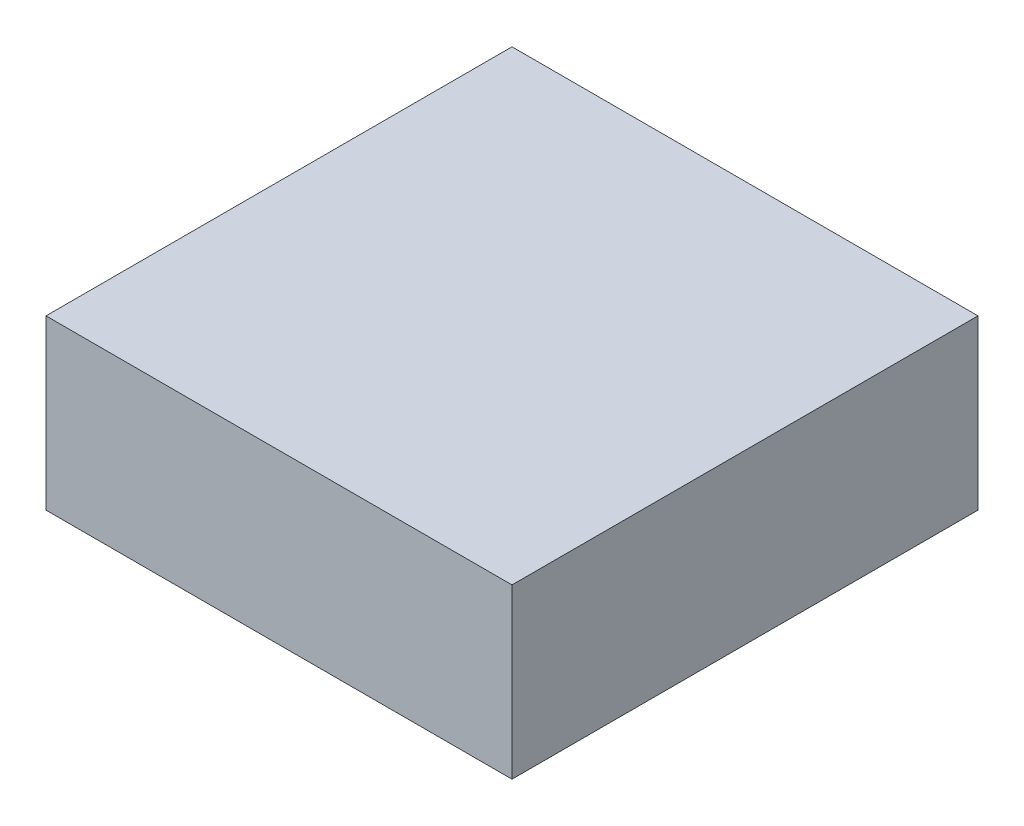
ISO-10303-21;
HEADER;
FILE_DESCRIPTION(('STEP AP214'),'2;1');
FILE_NAME('part.step','',(''),(''),'','','');
FILE_SCHEMA(('AUTOMOTIVE_DESIGN { 1 0 10303 214 1 1 1 1 }'));
ENDSEC;
DATA;
#1=APPLICATION_CONTEXT('core data for automotive mechanical design processes');
#2=APPLICATION_PROTOCOL_DEFINITION('international standard','automotive_design',2000,#1);
#3=PRODUCT_CONTEXT('',#1,'mechanical');
#4=PRODUCT('Part','Part','',(#3));
#5=PRODUCT_RELATED_PRODUCT_CATEGORY('part','',(#4));
#6=PRODUCT_DEFINITION_FORMATION('','',#4);
#7=PRODUCT_DEFINITION_CONTEXT('part definition',#1,'design');
#8=PRODUCT_DEFINITION('design','',#6,#7);
#9=PRODUCT_DEFINITION_SHAPE('','',#8);
#10=(LENGTH_UNIT() NAMED_UNIT(*) SI_UNIT(.MILLI.,.METRE.));
#11=(NAMED_UNIT(*) PLANE_ANGLE_UNIT() SI_UNIT($,.RADIAN.));
#12=(NAMED_UNIT(*) SI_UNIT($,.STERADIAN.) SOLID_ANGLE_UNIT());
#13=UNCERTAINTY_MEASURE_WITH_UNIT(LENGTH_MEASURE(1.E-05),#10,'distance_accuracy_value','');
#14=(GEOMETRIC_REPRESENTATION_CONTEXT(3) GLOBAL_UNCERTAINTY_ASSIGNED_CONTEXT((#13)) GLOBAL_UNIT_ASSIGNED_CONTEXT((#10,
#11,#12)) REPRESENTATION_CONTEXT('',''));
#15=CARTESIAN_POINT('',(0.,0.,0.));
#16=DIRECTION('',(0.,0.,1.));
#17=DIRECTION('',(1.,0.,0.));
#18=AXIS2_PLACEMENT_3D('',#15,#16,#17);
#19=CARTESIAN_POINT('',(0.,0.,0.));
#20=DIRECTION('',(0.,1.,0.));
#21=DIRECTION('',(0.,0.,1.));
#22=AXIS2_PLACEMENT_3D('',#19,#20,#21);
#23=PLANE('',#22);
#24=DIRECTION('',(0.,0.,-1.));
#25=VECTOR('',#24,1.);
#26=CARTESIAN_POINT('',(9.,0.,-9.));
#27=LINE('',#26,#25);
#28=CARTESIAN_POINT('',(9.00000000000001,0.,9.));
#29=VERTEX_POINT('',#28);
#30=CARTESIAN_POINT('',(9.,0.,-9.));
#31=VERTEX_POINT('',#30);
#32=EDGE_CURVE('E105',#29,#31,#27,.T.);
#33=ORIENTED_EDGE('',*,*,#32,.F.);
#34=DIRECTION('',(1.,0.,0.));
#35=VECTOR('',#34,1.);
#36=CARTESIAN_POINT('',(-8.99999999999999,0.,9.));
#37=LINE('',#36,#35);
#38=CARTESIAN_POINT('',(-8.99999999999999,0.,9.));
#39=VERTEX_POINT('',#38);
#40=EDGE_CURVE('E157',#39,#29,#37,.T.);
#41=ORIENTED_EDGE('',*,*,#40,.F.);
#42=DIRECTION('',(0.,0.,1.));
#43=VECTOR('',#42,1.);
#44=CARTESIAN_POINT('',(-9.,0.,-9.));
#45=LINE('',#44,#43);
#46=CARTESIAN_POINT('',(-9.,0.,-9.));
#47=VERTEX_POINT('',#46);
#48=EDGE_CURVE('E155',#47,#39,#45,.T.);
#49=ORIENTED_EDGE('',*,*,#48,.F.);
#50=DIRECTION('',(-1.,0.,0.));
#51=VECTOR('',#50,1.);
#52=CARTESIAN_POINT('',(-9.,0.,-9.));
#53=LINE('',#52,#51);
#54=EDGE_CURVE('E153',#31,#47,#53,.T.);
#55=ORIENTED_EDGE('',*,*,#54,.F.);
#56=EDGE_LOOP('',(#33,#41,#49,#55));
#57=FACE_BOUND('',#56,.T.);
#58=DIRECTION('',(0.,0.,-1.));
#59=VECTOR('',#58,1.);
#60=CARTESIAN_POINT('',(6.75,0.,-6.75));
#61=LINE('',#60,#59);
#62=CARTESIAN_POINT('',(6.75,0.,6.75));
#63=VERTEX_POINT('',#62);
#64=CARTESIAN_POINT('',(6.75,0.,-6.75));
#65=VERTEX_POINT('',#64);
#66=EDGE_CURVE('E56',#63,#65,#61,.T.);
#67=ORIENTED_EDGE('',*,*,#66,.T.);
#68=DIRECTION('',(-1.,0.,0.));
#69=VECTOR('',#68,1.);
#70=CARTESIAN_POINT('',(-6.75,0.,-6.75));
#71=LINE('',#70,#69);
#72=CARTESIAN_POINT('',(-6.75,0.,-6.75));
#73=VERTEX_POINT('',#72);
#74=EDGE_CURVE('E137',#65,#73,#71,.T.);
#75=ORIENTED_EDGE('',*,*,#74,.T.);
#76=DIRECTION('',(0.,0.,1.));
#77=VECTOR('',#76,1.);
#78=CARTESIAN_POINT('',(-6.75,0.,-6.75));
#79=LINE('',#78,#77);
#80=CARTESIAN_POINT('',(-6.75,0.,6.75));
#81=VERTEX_POINT('',#80);
#82=EDGE_CURVE('E140',#73,#81,#79,.T.);
#83=ORIENTED_EDGE('',*,*,#82,.T.);
#84=DIRECTION('',(1.,0.,0.));
#85=VECTOR('',#84,1.);
#86=CARTESIAN_POINT('',(-6.75,0.,6.75));
#87=LINE('',#86,#85);
#88=EDGE_CURVE('E128',#81,#63,#87,.T.);
#89=ORIENTED_EDGE('',*,*,#88,.T.);
#90=EDGE_LOOP('',(#67,#75,#83,#89));
#91=FACE_BOUND('',#90,.T.);
#92=ADVANCED_FACE('F33',(#57,#91),#23,.F.);
#93=CARTESIAN_POINT('',(9.,5.,-9.));
#94=DIRECTION('',(-1.,0.,0.));
#95=DIRECTION('',(0.,0.,1.));
#96=AXIS2_PLACEMENT_3D('',#93,#94,#95);
#97=PLANE('',#96);
#98=ORIENTED_EDGE('',*,*,#32,.T.);
#99=DIRECTION('',(0.,-1.,0.));
#100=VECTOR('',#99,1.);
#101=CARTESIAN_POINT('',(9.,5.,-9.));
#102=LINE('',#101,#100);
#103=CARTESIAN_POINT('',(9.00000000000001,6.5,-9.));
#104=VERTEX_POINT('',#103);
#105=EDGE_CURVE('E11',#104,#31,#102,.T.);
#106=ORIENTED_EDGE('',*,*,#105,.F.);
#107=DIRECTION('',(0.,0.,-1.));
#108=VECTOR('',#107,1.);
#109=CARTESIAN_POINT('',(9.00000000000001,6.5,-9.));
#110=LINE('',#109,#108);
#111=CARTESIAN_POINT('',(9.00000000000001,6.5,9.));
#112=VERTEX_POINT('',#111);
#113=EDGE_CURVE('E103',#112,#104,#110,.T.);
#114=ORIENTED_EDGE('',*,*,#113,.F.);
#115=DIRECTION('',(0.,-1.,0.));
#116=VECTOR('',#115,1.);
#117=CARTESIAN_POINT('',(9.00000000000001,5.,9.));
#118=LINE('',#117,#116);
#119=EDGE_CURVE('E159',#112,#29,#118,.T.);
#120=ORIENTED_EDGE('',*,*,#119,.T.);
#121=EDGE_LOOP('',(#98,#106,#114,#120));
#122=FACE_BOUND('',#121,.T.);
#123=ADVANCED_FACE('F35',(#122),#97,.F.);
#124=CARTESIAN_POINT('',(-9.,5.,-9.));
#125=DIRECTION('',(0.,0.,1.));
#126=DIRECTION('',(1.,0.,0.));
#127=AXIS2_PLACEMENT_3D('',#124,#125,#126);
#128=PLANE('',#127);
#129=ORIENTED_EDGE('',*,*,#54,.T.);
#130=DIRECTION('',(0.,-1.,0.));
#131=VECTOR('',#130,1.);
#132=CARTESIAN_POINT('',(-9.,5.,-9.));
#133=LINE('',#132,#131);
#134=CARTESIAN_POINT('',(-9.00000000000001,6.5,-9.));
#135=VERTEX_POINT('',#134);
#136=EDGE_CURVE('E41',#135,#47,#133,.T.);
#137=ORIENTED_EDGE('',*,*,#136,.F.);
#138=DIRECTION('',(-1.,0.,0.));
#139=VECTOR('',#138,1.);
#140=CARTESIAN_POINT('',(-9.00000000000001,6.5,-9.));
#141=LINE('',#140,#139);
#142=EDGE_CURVE('E108',#104,#135,#141,.T.);
#143=ORIENTED_EDGE('',*,*,#142,.F.);
#144=ORIENTED_EDGE('',*,*,#105,.T.);
#145=EDGE_LOOP('',(#129,#137,#143,#144));
#146=FACE_BOUND('',#145,.T.);
#147=ADVANCED_FACE('F109',(#146),#128,.F.);
#148=CARTESIAN_POINT('',(-9.,5.,-9.));
#149=DIRECTION('',(1.,0.,0.));
#150=DIRECTION('',(0.,0.,-1.));
#151=AXIS2_PLACEMENT_3D('',#148,#149,#150);
#152=PLANE('',#151);
#153=ORIENTED_EDGE('',*,*,#48,.T.);
#154=DIRECTION('',(0.,-1.,0.));
#155=VECTOR('',#154,1.);
#156=CARTESIAN_POINT('',(-8.99999999999999,5.,9.));
#157=LINE('',#156,#155);
#158=CARTESIAN_POINT('',(-9.00000000000001,6.5,9.));
#159=VERTEX_POINT('',#158);
#160=EDGE_CURVE('E161',#159,#39,#157,.T.);
#161=ORIENTED_EDGE('',*,*,#160,.F.);
#162=DIRECTION('',(0.,0.,1.));
#163=VECTOR('',#162,1.);
#164=CARTESIAN_POINT('',(-9.00000000000001,6.5,-9.));
#165=LINE('',#164,#163);
#166=EDGE_CURVE('E114',#135,#159,#165,.T.);
#167=ORIENTED_EDGE('',*,*,#166,.F.);
#168=ORIENTED_EDGE('',*,*,#136,.T.);
#169=EDGE_LOOP('',(#153,#161,#167,#168));
#170=FACE_BOUND('',#169,.T.);
#171=ADVANCED_FACE('F165',(#170),#152,.F.);
#172=CARTESIAN_POINT('',(-8.99999999999999,5.,9.));
#173=DIRECTION('',(0.,0.,-1.));
#174=DIRECTION('',(-1.,0.,0.));
#175=AXIS2_PLACEMENT_3D('',#172,#173,#174);
#176=PLANE('',#175);
#177=ORIENTED_EDGE('',*,*,#40,.T.);
#178=ORIENTED_EDGE('',*,*,#119,.F.);
#179=DIRECTION('',(1.,0.,0.));
#180=VECTOR('',#179,1.);
#181=CARTESIAN_POINT('',(-9.00000000000001,6.5,9.));
#182=LINE('',#181,#180);
#183=EDGE_CURVE('E119',#159,#112,#182,.T.);
#184=ORIENTED_EDGE('',*,*,#183,.F.);
#185=ORIENTED_EDGE('',*,*,#160,.T.);
#186=EDGE_LOOP('',(#177,#178,#184,#185));
#187=FACE_BOUND('',#186,.T.);
#188=ADVANCED_FACE('F170',(#187),#176,.F.);
#189=CARTESIAN_POINT('',(6.75,5.,-6.75));
#190=DIRECTION('',(-1.,0.,0.));
#191=DIRECTION('',(0.,0.,1.));
#192=AXIS2_PLACEMENT_3D('',#189,#190,#191);
#193=PLANE('',#192);
#194=ORIENTED_EDGE('',*,*,#66,.F.);
#195=DIRECTION('',(0.,-1.,0.));
#196=VECTOR('',#195,1.);
#197=CARTESIAN_POINT('',(6.75,5.,6.75));
#198=LINE('',#197,#196);
#199=CARTESIAN_POINT('',(6.75,5.,6.75));
#200=VERTEX_POINT('',#199);
#201=EDGE_CURVE('E135',#200,#63,#198,.T.);
#202=ORIENTED_EDGE('',*,*,#201,.F.);
#203=DIRECTION('',(0.,0.,-1.));
#204=VECTOR('',#203,1.);
#205=CARTESIAN_POINT('',(6.75,5.,-6.75));
#206=LINE('',#205,#204);
#207=CARTESIAN_POINT('',(6.75,5.,-6.75));
#208=VERTEX_POINT('',#207);
#209=EDGE_CURVE('E124',#200,#208,#206,.T.);
#210=ORIENTED_EDGE('',*,*,#209,.T.);
#211=DIRECTION('',(0.,-1.,0.));
#212=VECTOR('',#211,1.);
#213=CARTESIAN_POINT('',(6.75,5.,-6.75));
#214=LINE('',#213,#212);
#215=EDGE_CURVE('E150',#208,#65,#214,.T.);
#216=ORIENTED_EDGE('',*,*,#215,.T.);
#217=EDGE_LOOP('',(#194,#202,#210,#216));
#218=FACE_BOUND('',#217,.T.);
#219=ADVANCED_FACE('F172',(#218),#193,.T.);
#220=CARTESIAN_POINT('',(-6.75,5.,-6.75));
#221=DIRECTION('',(0.,0.,1.));
#222=DIRECTION('',(1.,0.,0.));
#223=AXIS2_PLACEMENT_3D('',#220,#221,#222);
#224=PLANE('',#223);
#225=ORIENTED_EDGE('',*,*,#74,.F.);
#226=ORIENTED_EDGE('',*,*,#215,.F.);
#227=DIRECTION('',(-1.,0.,0.));
#228=VECTOR('',#227,1.);
#229=CARTESIAN_POINT('',(-6.75,5.,-6.75));
#230=LINE('',#229,#228);
#231=CARTESIAN_POINT('',(-6.75,5.,-6.75));
#232=VERTEX_POINT('',#231);
#233=EDGE_CURVE('E127',#208,#232,#230,.T.);
#234=ORIENTED_EDGE('',*,*,#233,.T.);
#235=DIRECTION('',(0.,-1.,0.));
#236=VECTOR('',#235,1.);
#237=CARTESIAN_POINT('',(-6.75,5.,-6.75));
#238=LINE('',#237,#236);
#239=EDGE_CURVE('E148',#232,#73,#238,.T.);
#240=ORIENTED_EDGE('',*,*,#239,.T.);
#241=EDGE_LOOP('',(#225,#226,#234,#240));
#242=FACE_BOUND('',#241,.T.);
#243=ADVANCED_FACE('F178',(#242),#224,.T.);
#244=CARTESIAN_POINT('',(-6.75,5.,-6.75));
#245=DIRECTION('',(1.,0.,0.));
#246=DIRECTION('',(0.,0.,-1.));
#247=AXIS2_PLACEMENT_3D('',#244,#245,#246);
#248=PLANE('',#247);
#249=ORIENTED_EDGE('',*,*,#82,.F.);
#250=ORIENTED_EDGE('',*,*,#239,.F.);
#251=DIRECTION('',(0.,0.,1.));
#252=VECTOR('',#251,1.);
#253=CARTESIAN_POINT('',(-6.75,5.,-6.75));
#254=LINE('',#253,#252);
#255=CARTESIAN_POINT('',(-6.75,5.,6.75));
#256=VERTEX_POINT('',#255);
#257=EDGE_CURVE('E131',#232,#256,#254,.T.);
#258=ORIENTED_EDGE('',*,*,#257,.T.);
#259=DIRECTION('',(0.,-1.,0.));
#260=VECTOR('',#259,1.);
#261=CARTESIAN_POINT('',(-6.75,5.,6.75));
#262=LINE('',#261,#260);
#263=EDGE_CURVE('E146',#256,#81,#262,.T.);
#264=ORIENTED_EDGE('',*,*,#263,.T.);
#265=EDGE_LOOP('',(#249,#250,#258,#264));
#266=FACE_BOUND('',#265,.T.);
#267=ADVANCED_FACE('F189',(#266),#248,.T.);
#268=CARTESIAN_POINT('',(-6.75,5.,6.75));
#269=DIRECTION('',(0.,0.,-1.));
#270=DIRECTION('',(-1.,0.,0.));
#271=AXIS2_PLACEMENT_3D('',#268,#269,#270);
#272=PLANE('',#271);
#273=ORIENTED_EDGE('',*,*,#88,.F.);
#274=ORIENTED_EDGE('',*,*,#263,.F.);
#275=DIRECTION('',(1.,0.,0.));
#276=VECTOR('',#275,1.);
#277=CARTESIAN_POINT('',(-6.75,5.,6.75));
#278=LINE('',#277,#276);
#279=EDGE_CURVE('E48',#256,#200,#278,.T.);
#280=ORIENTED_EDGE('',*,*,#279,.T.);
#281=ORIENTED_EDGE('',*,*,#201,.T.);
#282=EDGE_LOOP('',(#273,#274,#280,#281));
#283=FACE_BOUND('',#282,.T.);
#284=ADVANCED_FACE('F193',(#283),#272,.T.);
#285=CARTESIAN_POINT('',(0.,5.,0.));
#286=DIRECTION('',(0.,1.,0.));
#287=DIRECTION('',(0.,0.,1.));
#288=AXIS2_PLACEMENT_3D('',#285,#286,#287);
#289=PLANE('',#288);
#290=ORIENTED_EDGE('',*,*,#233,.F.);
#291=ORIENTED_EDGE('',*,*,#209,.F.);
#292=ORIENTED_EDGE('',*,*,#279,.F.);
#293=ORIENTED_EDGE('',*,*,#257,.F.);
#294=EDGE_LOOP('',(#290,#291,#292,#293));
#295=FACE_BOUND('',#294,.T.);
#296=ADVANCED_FACE('F197',(#295),#289,.F.);
#297=CARTESIAN_POINT('',(0.,6.5,0.));
#298=DIRECTION('',(0.,1.,0.));
#299=DIRECTION('',(0.,0.,1.));
#300=AXIS2_PLACEMENT_3D('',#297,#298,#299);
#301=PLANE('',#300);
#302=ORIENTED_EDGE('',*,*,#113,.T.);
#303=ORIENTED_EDGE('',*,*,#142,.T.);
#304=ORIENTED_EDGE('',*,*,#166,.T.);
#305=ORIENTED_EDGE('',*,*,#183,.T.);
#306=EDGE_LOOP('',(#302,#303,#304,#305));
#307=FACE_BOUND('',#306,.T.);
#308=ADVANCED_FACE('F117',(#307),#301,.T.);
#309=CLOSED_SHELL('',(#92,#123,#147,#171,#188,#219,#243,#267,#284,#296,#308));
#310=MANIFOLD_SOLID_BREP('B2',#309);
#311=ADVANCED_BREP_SHAPE_REPRESENTATION('',(#18,#310),#14);
#312=SHAPE_DEFINITION_REPRESENTATION(#9,#311);
ENDSEC;
END-ISO-10303-21;
